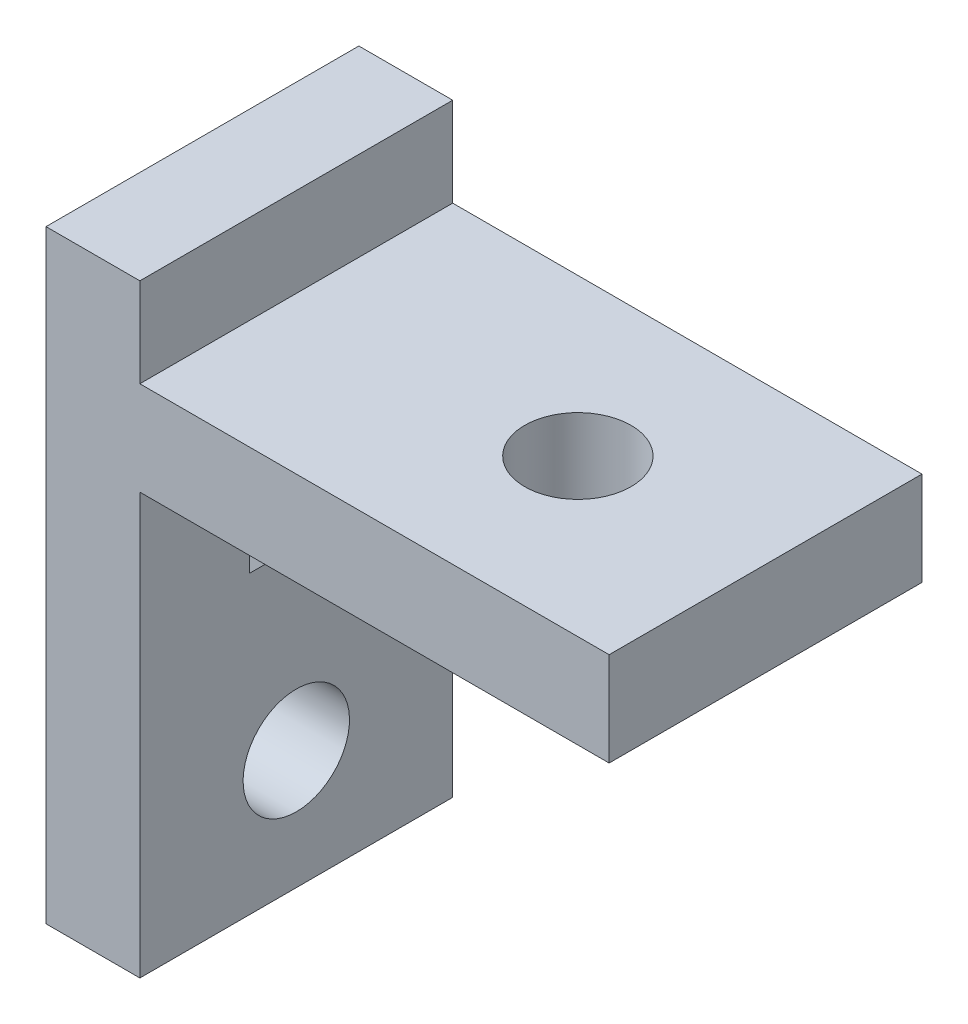
ISO-10303-21;
HEADER;
FILE_DESCRIPTION(('STEP AP214'),'2;1');
FILE_NAME('part.step','',(''),(''),'','','');
FILE_SCHEMA(('AUTOMOTIVE_DESIGN { 1 0 10303 214 1 1 1 1 }'));
ENDSEC;
DATA;
#1=APPLICATION_CONTEXT('core data for automotive mechanical design processes');
#2=APPLICATION_PROTOCOL_DEFINITION('international standard','automotive_design',2000,#1);
#3=PRODUCT_CONTEXT('',#1,'mechanical');
#4=PRODUCT('Part','Part','',(#3));
#5=PRODUCT_RELATED_PRODUCT_CATEGORY('part','',(#4));
#6=PRODUCT_DEFINITION_FORMATION('','',#4);
#7=PRODUCT_DEFINITION_CONTEXT('part definition',#1,'design');
#8=PRODUCT_DEFINITION('design','',#6,#7);
#9=PRODUCT_DEFINITION_SHAPE('','',#8);
#10=(LENGTH_UNIT() NAMED_UNIT(*) SI_UNIT(.MILLI.,.METRE.));
#11=(NAMED_UNIT(*) PLANE_ANGLE_UNIT() SI_UNIT($,.RADIAN.));
#12=(NAMED_UNIT(*) SI_UNIT($,.STERADIAN.) SOLID_ANGLE_UNIT());
#13=UNCERTAINTY_MEASURE_WITH_UNIT(LENGTH_MEASURE(1.E-05),#10,'distance_accuracy_value','');
#14=(GEOMETRIC_REPRESENTATION_CONTEXT(3) GLOBAL_UNCERTAINTY_ASSIGNED_CONTEXT((#13)) GLOBAL_UNIT_ASSIGNED_CONTEXT((#10,
#11,#12)) REPRESENTATION_CONTEXT('',''));
#15=CARTESIAN_POINT('',(0.,0.,0.));
#16=DIRECTION('',(0.,0.,1.));
#17=DIRECTION('',(1.,0.,0.));
#18=AXIS2_PLACEMENT_3D('',#15,#16,#17);
#19=CARTESIAN_POINT('',(0.,16.45,5.));
#20=DIRECTION('',(1.,0.,0.));
#21=DIRECTION('',(0.,1.,0.));
#22=AXIS2_PLACEMENT_3D('',#19,#20,#21);
#23=PLANE('',#22);
#24=CARTESIAN_POINT('',(0.,3.8,0.));
#25=DIRECTION('',(-1.,0.,0.));
#26=DIRECTION('',(0.,-1.,0.));
#27=AXIS2_PLACEMENT_3D('',#24,#25,#26);
#28=CIRCLE('',#27,1.7);
#29=CARTESIAN_POINT('',(0.,2.1,0.));
#30=VERTEX_POINT('',#29);
#31=EDGE_CURVE('E232',#30,#30,#28,.T.);
#32=ORIENTED_EDGE('',*,*,#31,.F.);
#33=EDGE_LOOP('',(#32));
#34=FACE_BOUND('',#33,.T.);
#35=DIRECTION('',(0.,-1.,0.));
#36=VECTOR('',#35,1.);
#37=CARTESIAN_POINT('',(0.,16.45,-5.));
#38=LINE('',#37,#36);
#39=CARTESIAN_POINT('',(0.,19.3,-5.));
#40=VERTEX_POINT('',#39);
#41=CARTESIAN_POINT('',(0.,0.,-5.));
#42=VERTEX_POINT('',#41);
#43=EDGE_CURVE('E220',#40,#42,#38,.T.);
#44=ORIENTED_EDGE('',*,*,#43,.T.);
#45=DIRECTION('',(0.,0.,-1.));
#46=VECTOR('',#45,1.);
#47=CARTESIAN_POINT('',(0.,0.,5.));
#48=LINE('',#47,#46);
#49=CARTESIAN_POINT('',(0.,0.,5.));
#50=VERTEX_POINT('',#49);
#51=EDGE_CURVE('E11',#50,#42,#48,.T.);
#52=ORIENTED_EDGE('',*,*,#51,.F.);
#53=DIRECTION('',(0.,-1.,0.));
#54=VECTOR('',#53,1.);
#55=CARTESIAN_POINT('',(0.,16.45,5.));
#56=LINE('',#55,#54);
#57=CARTESIAN_POINT('',(0.,19.3,5.));
#58=VERTEX_POINT('',#57);
#59=EDGE_CURVE('E183',#58,#50,#56,.T.);
#60=ORIENTED_EDGE('',*,*,#59,.F.);
#61=DIRECTION('',(0.,0.,1.));
#62=VECTOR('',#61,1.);
#63=CARTESIAN_POINT('',(0.,19.3,-9.13793426724012));
#64=LINE('',#63,#62);
#65=EDGE_CURVE('E149',#40,#58,#64,.T.);
#66=ORIENTED_EDGE('',*,*,#65,.F.);
#67=EDGE_LOOP('',(#44,#52,#60,#66));
#68=FACE_BOUND('',#67,.T.);
#69=ADVANCED_FACE('F33',(#34,#68),#23,.F.);
#70=CARTESIAN_POINT('',(0.,0.,5.));
#71=DIRECTION('',(0.,1.,0.));
#72=DIRECTION('',(0.,0.,1.));
#73=AXIS2_PLACEMENT_3D('',#70,#71,#72);
#74=PLANE('',#73);
#75=DIRECTION('',(1.,0.,0.));
#76=VECTOR('',#75,1.);
#77=CARTESIAN_POINT('',(0.,0.,-5.));
#78=LINE('',#77,#76);
#79=CARTESIAN_POINT('',(3.,0.,-5.));
#80=VERTEX_POINT('',#79);
#81=EDGE_CURVE('E218',#42,#80,#78,.T.);
#82=ORIENTED_EDGE('',*,*,#81,.T.);
#83=DIRECTION('',(0.,0.,-1.));
#84=VECTOR('',#83,1.);
#85=CARTESIAN_POINT('',(3.,0.,5.));
#86=LINE('',#85,#84);
#87=CARTESIAN_POINT('',(3.,0.,5.));
#88=VERTEX_POINT('',#87);
#89=EDGE_CURVE('E41',#88,#80,#86,.T.);
#90=ORIENTED_EDGE('',*,*,#89,.F.);
#91=DIRECTION('',(1.,0.,0.));
#92=VECTOR('',#91,1.);
#93=CARTESIAN_POINT('',(0.,0.,5.));
#94=LINE('',#93,#92);
#95=EDGE_CURVE('E187',#50,#88,#94,.T.);
#96=ORIENTED_EDGE('',*,*,#95,.F.);
#97=ORIENTED_EDGE('',*,*,#51,.T.);
#98=EDGE_LOOP('',(#82,#90,#96,#97));
#99=FACE_BOUND('',#98,.T.);
#100=ADVANCED_FACE('F256',(#99),#74,.F.);
#101=CARTESIAN_POINT('',(3.,0.,5.));
#102=DIRECTION('',(-1.,0.,0.));
#103=DIRECTION('',(0.,-1.,0.));
#104=AXIS2_PLACEMENT_3D('',#101,#102,#103);
#105=PLANE('',#104);
#106=CARTESIAN_POINT('',(3.,3.8,0.));
#107=DIRECTION('',(-1.,0.,0.));
#108=DIRECTION('',(0.,-1.,0.));
#109=AXIS2_PLACEMENT_3D('',#106,#107,#108);
#110=CIRCLE('',#109,1.7);
#111=CARTESIAN_POINT('',(3.,2.1,0.));
#112=VERTEX_POINT('',#111);
#113=EDGE_CURVE('E194',#112,#112,#110,.T.);
#114=ORIENTED_EDGE('',*,*,#113,.T.);
#115=EDGE_LOOP('',(#114));
#116=FACE_BOUND('',#115,.T.);
#117=DIRECTION('',(0.,0.,-1.));
#118=VECTOR('',#117,1.);
#119=CARTESIAN_POINT('',(3.,9.45,1.5));
#120=LINE('',#119,#118);
#121=CARTESIAN_POINT('',(3.,9.45,1.5));
#122=VERTEX_POINT('',#121);
#123=CARTESIAN_POINT('',(3.,9.45,-1.5));
#124=VERTEX_POINT('',#123);
#125=EDGE_CURVE('E49',#122,#124,#120,.T.);
#126=ORIENTED_EDGE('',*,*,#125,.F.);
#127=DIRECTION('',(0.,-1.,0.));
#128=VECTOR('',#127,1.);
#129=CARTESIAN_POINT('',(3.,9.45,1.5));
#130=LINE('',#129,#128);
#131=CARTESIAN_POINT('',(3.,13.45,1.5));
#132=VERTEX_POINT('',#131);
#133=EDGE_CURVE('E275',#132,#122,#130,.T.);
#134=ORIENTED_EDGE('',*,*,#133,.F.);
#135=DIRECTION('',(0.,0.,-1.));
#136=VECTOR('',#135,1.);
#137=CARTESIAN_POINT('',(3.,13.45,5.));
#138=LINE('',#137,#136);
#139=CARTESIAN_POINT('',(3.,13.45,5.));
#140=VERTEX_POINT('',#139);
#141=EDGE_CURVE('E205',#140,#132,#138,.T.);
#142=ORIENTED_EDGE('',*,*,#141,.F.);
#143=DIRECTION('',(0.,1.,0.));
#144=VECTOR('',#143,1.);
#145=CARTESIAN_POINT('',(3.,0.,5.));
#146=LINE('',#145,#144);
#147=EDGE_CURVE('E216',#88,#140,#146,.T.);
#148=ORIENTED_EDGE('',*,*,#147,.F.);
#149=ORIENTED_EDGE('',*,*,#89,.T.);
#150=DIRECTION('',(0.,1.,0.));
#151=VECTOR('',#150,1.);
#152=CARTESIAN_POINT('',(3.,0.,-5.));
#153=LINE('',#152,#151);
#154=CARTESIAN_POINT('',(3.,13.45,-5.));
#155=VERTEX_POINT('',#154);
#156=EDGE_CURVE('E213',#80,#155,#153,.T.);
#157=ORIENTED_EDGE('',*,*,#156,.T.);
#158=CARTESIAN_POINT('',(3.,13.45,-1.5));
#159=VERTEX_POINT('',#158);
#160=EDGE_CURVE('E204',#159,#155,#138,.T.);
#161=ORIENTED_EDGE('',*,*,#160,.F.);
#162=DIRECTION('',(0.,-1.,0.));
#163=VECTOR('',#162,1.);
#164=CARTESIAN_POINT('',(3.,9.45,-1.5));
#165=LINE('',#164,#163);
#166=EDGE_CURVE('E54',#159,#124,#165,.T.);
#167=ORIENTED_EDGE('',*,*,#166,.T.);
#168=EDGE_LOOP('',(#126,#134,#142,#148,#149,#157,#161,#167));
#169=FACE_BOUND('',#168,.T.);
#170=ADVANCED_FACE('F212',(#116,#169),#105,.F.);
#171=CARTESIAN_POINT('',(3.,13.45,5.));
#172=DIRECTION('',(0.,1.,0.));
#173=DIRECTION('',(0.,0.,1.));
#174=AXIS2_PLACEMENT_3D('',#171,#172,#173);
#175=PLANE('',#174);
#176=CARTESIAN_POINT('',(12.,13.45,0.));
#177=DIRECTION('',(0.,-1.,0.));
#178=DIRECTION('',(0.,0.,-1.));
#179=AXIS2_PLACEMENT_3D('',#176,#177,#178);
#180=CIRCLE('',#179,1.7);
#181=CARTESIAN_POINT('',(12.,13.45,-1.7));
#182=VERTEX_POINT('',#181);
#183=EDGE_CURVE('E143',#182,#182,#180,.T.);
#184=ORIENTED_EDGE('',*,*,#183,.F.);
#185=EDGE_LOOP('',(#184));
#186=FACE_BOUND('',#185,.T.);
#187=ORIENTED_EDGE('',*,*,#141,.T.);
#188=DIRECTION('',(-1.,0.,0.));
#189=VECTOR('',#188,1.);
#190=CARTESIAN_POINT('',(3.,13.45,1.5));
#191=LINE('',#190,#189);
#192=CARTESIAN_POINT('',(7.,13.45,1.5));
#193=VERTEX_POINT('',#192);
#194=EDGE_CURVE('E122',#193,#132,#191,.T.);
#195=ORIENTED_EDGE('',*,*,#194,.F.);
#196=DIRECTION('',(0.,0.,-1.));
#197=VECTOR('',#196,1.);
#198=CARTESIAN_POINT('',(7.,13.45,1.5));
#199=LINE('',#198,#197);
#200=CARTESIAN_POINT('',(7.,13.45,-1.5));
#201=VERTEX_POINT('',#200);
#202=EDGE_CURVE('E115',#193,#201,#199,.T.);
#203=ORIENTED_EDGE('',*,*,#202,.T.);
#204=DIRECTION('',(-1.,0.,0.));
#205=VECTOR('',#204,1.);
#206=CARTESIAN_POINT('',(3.,13.45,-1.5));
#207=LINE('',#206,#205);
#208=EDGE_CURVE('E120',#201,#159,#207,.T.);
#209=ORIENTED_EDGE('',*,*,#208,.T.);
#210=ORIENTED_EDGE('',*,*,#160,.T.);
#211=DIRECTION('',(1.,0.,0.));
#212=VECTOR('',#211,1.);
#213=CARTESIAN_POINT('',(3.,13.45,-5.));
#214=LINE('',#213,#212);
#215=CARTESIAN_POINT('',(18.,13.45,-5.));
#216=VERTEX_POINT('',#215);
#217=EDGE_CURVE('E189',#155,#216,#214,.T.);
#218=ORIENTED_EDGE('',*,*,#217,.T.);
#219=DIRECTION('',(0.,0.,-1.));
#220=VECTOR('',#219,1.);
#221=CARTESIAN_POINT('',(18.,13.45,5.));
#222=LINE('',#221,#220);
#223=CARTESIAN_POINT('',(18.,13.45,5.));
#224=VERTEX_POINT('',#223);
#225=EDGE_CURVE('E201',#224,#216,#222,.T.);
#226=ORIENTED_EDGE('',*,*,#225,.F.);
#227=DIRECTION('',(1.,0.,0.));
#228=VECTOR('',#227,1.);
#229=CARTESIAN_POINT('',(3.,13.45,5.));
#230=LINE('',#229,#228);
#231=EDGE_CURVE('E228',#140,#224,#230,.T.);
#232=ORIENTED_EDGE('',*,*,#231,.F.);
#233=EDGE_LOOP('',(#187,#195,#203,#209,#210,#218,#226,#232));
#234=FACE_BOUND('',#233,.T.);
#235=ADVANCED_FACE('F118',(#186,#234),#175,.F.);
#236=CARTESIAN_POINT('',(18.,13.45,5.));
#237=DIRECTION('',(-1.,0.,0.));
#238=DIRECTION('',(0.,0.,1.));
#239=AXIS2_PLACEMENT_3D('',#236,#237,#238);
#240=PLANE('',#239);
#241=DIRECTION('',(0.,1.,0.));
#242=VECTOR('',#241,1.);
#243=CARTESIAN_POINT('',(18.,13.45,-5.));
#244=LINE('',#243,#242);
#245=CARTESIAN_POINT('',(18.,16.45,-5.));
#246=VERTEX_POINT('',#245);
#247=EDGE_CURVE('E184',#216,#246,#244,.T.);
#248=ORIENTED_EDGE('',*,*,#247,.T.);
#249=DIRECTION('',(0.,0.,-1.));
#250=VECTOR('',#249,1.);
#251=CARTESIAN_POINT('',(18.,16.45,5.));
#252=LINE('',#251,#250);
#253=CARTESIAN_POINT('',(18.,16.45,5.));
#254=VERTEX_POINT('',#253);
#255=EDGE_CURVE('E182',#254,#246,#252,.T.);
#256=ORIENTED_EDGE('',*,*,#255,.F.);
#257=DIRECTION('',(0.,1.,0.));
#258=VECTOR('',#257,1.);
#259=CARTESIAN_POINT('',(18.,13.45,5.));
#260=LINE('',#259,#258);
#261=EDGE_CURVE('E226',#224,#254,#260,.T.);
#262=ORIENTED_EDGE('',*,*,#261,.F.);
#263=ORIENTED_EDGE('',*,*,#225,.T.);
#264=EDGE_LOOP('',(#248,#256,#262,#263));
#265=FACE_BOUND('',#264,.T.);
#266=ADVANCED_FACE('F272',(#265),#240,.F.);
#267=CARTESIAN_POINT('',(18.,16.45,5.));
#268=DIRECTION('',(0.,-1.,0.));
#269=DIRECTION('',(0.,0.,-1.));
#270=AXIS2_PLACEMENT_3D('',#267,#268,#269);
#271=PLANE('',#270);
#272=CARTESIAN_POINT('',(12.,16.45,0.));
#273=DIRECTION('',(0.,-1.,0.));
#274=DIRECTION('',(0.,0.,-1.));
#275=AXIS2_PLACEMENT_3D('',#272,#273,#274);
#276=CIRCLE('',#275,1.7);
#277=CARTESIAN_POINT('',(12.,16.45,-1.7));
#278=VERTEX_POINT('',#277);
#279=EDGE_CURVE('E156',#278,#278,#276,.T.);
#280=ORIENTED_EDGE('',*,*,#279,.T.);
#281=EDGE_LOOP('',(#280));
#282=FACE_BOUND('',#281,.T.);
#283=DIRECTION('',(-1.,0.,0.));
#284=VECTOR('',#283,1.);
#285=CARTESIAN_POINT('',(18.,16.45,-5.));
#286=LINE('',#285,#284);
#287=CARTESIAN_POINT('',(3.,16.45,-5.));
#288=VERTEX_POINT('',#287);
#289=EDGE_CURVE('E170',#246,#288,#286,.T.);
#290=ORIENTED_EDGE('',*,*,#289,.T.);
#291=DIRECTION('',(0.,0.,1.));
#292=VECTOR('',#291,1.);
#293=CARTESIAN_POINT('',(3.,16.45,-9.13793426724012));
#294=LINE('',#293,#292);
#295=CARTESIAN_POINT('',(3.,16.45,5.));
#296=VERTEX_POINT('',#295);
#297=EDGE_CURVE('E148',#288,#296,#294,.T.);
#298=ORIENTED_EDGE('',*,*,#297,.T.);
#299=DIRECTION('',(-1.,0.,0.));
#300=VECTOR('',#299,1.);
#301=CARTESIAN_POINT('',(18.,16.45,5.));
#302=LINE('',#301,#300);
#303=EDGE_CURVE('E195',#254,#296,#302,.T.);
#304=ORIENTED_EDGE('',*,*,#303,.F.);
#305=ORIENTED_EDGE('',*,*,#255,.T.);
#306=EDGE_LOOP('',(#290,#298,#304,#305));
#307=FACE_BOUND('',#306,.T.);
#308=ADVANCED_FACE('F180',(#282,#307),#271,.F.);
#309=CARTESIAN_POINT('',(0.,0.,5.));
#310=DIRECTION('',(0.,0.,1.));
#311=DIRECTION('',(1.,0.,0.));
#312=AXIS2_PLACEMENT_3D('',#309,#310,#311);
#313=PLANE('',#312);
#314=ORIENTED_EDGE('',*,*,#59,.T.);
#315=ORIENTED_EDGE('',*,*,#95,.T.);
#316=ORIENTED_EDGE('',*,*,#147,.T.);
#317=ORIENTED_EDGE('',*,*,#231,.T.);
#318=ORIENTED_EDGE('',*,*,#261,.T.);
#319=ORIENTED_EDGE('',*,*,#303,.T.);
#320=DIRECTION('',(0.,1.,0.));
#321=VECTOR('',#320,1.);
#322=CARTESIAN_POINT('',(3.,16.45,5.));
#323=LINE('',#322,#321);
#324=CARTESIAN_POINT('',(3.,19.3,5.));
#325=VERTEX_POINT('',#324);
#326=EDGE_CURVE('E140',#296,#325,#323,.T.);
#327=ORIENTED_EDGE('',*,*,#326,.T.);
#328=DIRECTION('',(-1.,0.,0.));
#329=VECTOR('',#328,1.);
#330=CARTESIAN_POINT('',(0.,19.3,5.));
#331=LINE('',#330,#329);
#332=EDGE_CURVE('E145',#325,#58,#331,.T.);
#333=ORIENTED_EDGE('',*,*,#332,.T.);
#334=EDGE_LOOP('',(#314,#315,#316,#317,#318,#319,#327,#333));
#335=FACE_BOUND('',#334,.T.);
#336=ADVANCED_FACE('F267',(#335),#313,.T.);
#337=CARTESIAN_POINT('',(0.,0.,-5.));
#338=DIRECTION('',(0.,0.,1.));
#339=DIRECTION('',(1.,0.,0.));
#340=AXIS2_PLACEMENT_3D('',#337,#338,#339);
#341=PLANE('',#340);
#342=ORIENTED_EDGE('',*,*,#43,.F.);
#343=DIRECTION('',(1.,0.,0.));
#344=VECTOR('',#343,1.);
#345=CARTESIAN_POINT('',(0.,19.3,-5.));
#346=LINE('',#345,#344);
#347=CARTESIAN_POINT('',(3.,19.3,-5.));
#348=VERTEX_POINT('',#347);
#349=EDGE_CURVE('E141',#40,#348,#346,.T.);
#350=ORIENTED_EDGE('',*,*,#349,.T.);
#351=DIRECTION('',(0.,-1.,0.));
#352=VECTOR('',#351,1.);
#353=CARTESIAN_POINT('',(3.,16.45,-5.));
#354=LINE('',#353,#352);
#355=EDGE_CURVE('E144',#348,#288,#354,.T.);
#356=ORIENTED_EDGE('',*,*,#355,.T.);
#357=ORIENTED_EDGE('',*,*,#289,.F.);
#358=ORIENTED_EDGE('',*,*,#247,.F.);
#359=ORIENTED_EDGE('',*,*,#217,.F.);
#360=ORIENTED_EDGE('',*,*,#156,.F.);
#361=ORIENTED_EDGE('',*,*,#81,.F.);
#362=EDGE_LOOP('',(#342,#350,#356,#357,#358,#359,#360,#361));
#363=FACE_BOUND('',#362,.T.);
#364=ADVANCED_FACE('F167',(#363),#341,.F.);
#365=CARTESIAN_POINT('',(18.,3.79999999999999,0.));
#366=DIRECTION('',(-1.,0.,0.));
#367=DIRECTION('',(0.,-1.,0.));
#368=AXIS2_PLACEMENT_3D('',#365,#366,#367);
#369=CYLINDRICAL_SURFACE('',#368,1.7);
#370=ORIENTED_EDGE('',*,*,#31,.T.);
#371=EDGE_LOOP('',(#370));
#372=FACE_BOUND('',#371,.T.);
#373=ORIENTED_EDGE('',*,*,#113,.F.);
#374=EDGE_LOOP('',(#373));
#375=FACE_BOUND('',#374,.T.);
#376=ADVANCED_FACE('F244',(#372,#375),#369,.F.);
#377=CARTESIAN_POINT('',(12.,16.45,0.));
#378=DIRECTION('',(0.,-1.,0.));
#379=DIRECTION('',(0.,0.,-1.));
#380=AXIS2_PLACEMENT_3D('',#377,#378,#379);
#381=CYLINDRICAL_SURFACE('',#380,1.7);
#382=ORIENTED_EDGE('',*,*,#279,.F.);
#383=EDGE_LOOP('',(#382));
#384=FACE_BOUND('',#383,.T.);
#385=ORIENTED_EDGE('',*,*,#183,.T.);
#386=EDGE_LOOP('',(#385));
#387=FACE_BOUND('',#386,.T.);
#388=ADVANCED_FACE('F241',(#384,#387),#381,.F.);
#389=CARTESIAN_POINT('',(0.,19.3,-9.13793426724012));
#390=DIRECTION('',(0.,1.,0.));
#391=DIRECTION('',(0.,0.,1.));
#392=AXIS2_PLACEMENT_3D('',#389,#390,#391);
#393=PLANE('',#392);
#394=ORIENTED_EDGE('',*,*,#349,.F.);
#395=ORIENTED_EDGE('',*,*,#65,.T.);
#396=ORIENTED_EDGE('',*,*,#332,.F.);
#397=DIRECTION('',(0.,0.,1.));
#398=VECTOR('',#397,1.);
#399=CARTESIAN_POINT('',(3.,19.3,-9.13793426724012));
#400=LINE('',#399,#398);
#401=EDGE_CURVE('E152',#348,#325,#400,.T.);
#402=ORIENTED_EDGE('',*,*,#401,.F.);
#403=EDGE_LOOP('',(#394,#395,#396,#402));
#404=FACE_BOUND('',#403,.T.);
#405=ADVANCED_FACE('F243',(#404),#393,.T.);
#406=CARTESIAN_POINT('',(3.,16.45,-9.13793426724012));
#407=DIRECTION('',(1.,0.,0.));
#408=DIRECTION('',(0.,0.,-1.));
#409=AXIS2_PLACEMENT_3D('',#406,#407,#408);
#410=PLANE('',#409);
#411=ORIENTED_EDGE('',*,*,#355,.F.);
#412=ORIENTED_EDGE('',*,*,#401,.T.);
#413=ORIENTED_EDGE('',*,*,#326,.F.);
#414=ORIENTED_EDGE('',*,*,#297,.F.);
#415=EDGE_LOOP('',(#411,#412,#413,#414));
#416=FACE_BOUND('',#415,.T.);
#417=ADVANCED_FACE('F174',(#416),#410,.T.);
#418=CARTESIAN_POINT('',(7.,13.45,1.5));
#419=DIRECTION('',(-0.707106781186547,0.707106781186547,0.));
#420=DIRECTION('',(-0.707106781186548,-0.707106781186548,0.));
#421=AXIS2_PLACEMENT_3D('',#418,#419,#420);
#422=PLANE('',#421);
#423=DIRECTION('',(0.707106781186548,0.707106781186548,0.));
#424=VECTOR('',#423,1.);
#425=CARTESIAN_POINT('',(7.,13.45,-1.5));
#426=LINE('',#425,#424);
#427=EDGE_CURVE('E129',#124,#201,#426,.T.);
#428=ORIENTED_EDGE('',*,*,#427,.T.);
#429=ORIENTED_EDGE('',*,*,#202,.F.);
#430=DIRECTION('',(0.707106781186548,0.707106781186548,0.));
#431=VECTOR('',#430,1.);
#432=CARTESIAN_POINT('',(7.,13.45,1.5));
#433=LINE('',#432,#431);
#434=EDGE_CURVE('E126',#122,#193,#433,.T.);
#435=ORIENTED_EDGE('',*,*,#434,.F.);
#436=ORIENTED_EDGE('',*,*,#125,.T.);
#437=EDGE_LOOP('',(#428,#429,#435,#436));
#438=FACE_BOUND('',#437,.T.);
#439=ADVANCED_FACE('F130',(#438),#422,.F.);
#440=CARTESIAN_POINT('',(0.,0.,1.5));
#441=DIRECTION('',(0.,0.,1.));
#442=DIRECTION('',(1.,0.,0.));
#443=AXIS2_PLACEMENT_3D('',#440,#441,#442);
#444=PLANE('',#443);
#445=ORIENTED_EDGE('',*,*,#194,.T.);
#446=ORIENTED_EDGE('',*,*,#133,.T.);
#447=ORIENTED_EDGE('',*,*,#434,.T.);
#448=EDGE_LOOP('',(#445,#446,#447));
#449=FACE_BOUND('',#448,.T.);
#450=ADVANCED_FACE('F274',(#449),#444,.T.);
#451=CARTESIAN_POINT('',(0.,0.,-1.5));
#452=DIRECTION('',(0.,0.,1.));
#453=DIRECTION('',(1.,0.,0.));
#454=AXIS2_PLACEMENT_3D('',#451,#452,#453);
#455=PLANE('',#454);
#456=ORIENTED_EDGE('',*,*,#208,.F.);
#457=ORIENTED_EDGE('',*,*,#427,.F.);
#458=ORIENTED_EDGE('',*,*,#166,.F.);
#459=EDGE_LOOP('',(#456,#457,#458));
#460=FACE_BOUND('',#459,.T.);
#461=ADVANCED_FACE('F133',(#460),#455,.F.);
#462=CLOSED_SHELL('',(#69,#100,#170,#235,#266,#308,#336,#364,#376,#388,#405,#417,#439,#450,#461));
#463=MANIFOLD_SOLID_BREP('B2',#462);
#464=ADVANCED_BREP_SHAPE_REPRESENTATION('',(#18,#463),#14);
#465=SHAPE_DEFINITION_REPRESENTATION(#9,#464);
ENDSEC;
END-ISO-10303-21;
